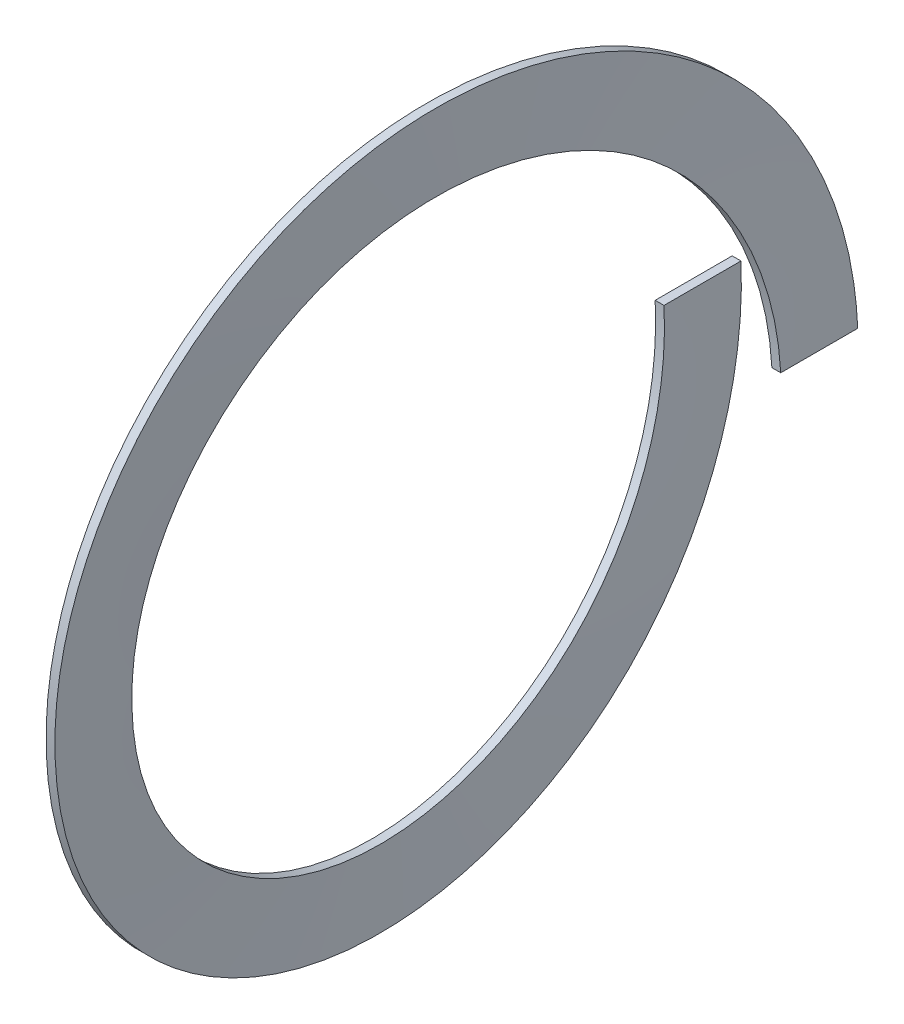
ISO-10303-21;
HEADER;
FILE_DESCRIPTION(('STEP AP214'),'2;1');
FILE_NAME('part.step','',(''),(''),'','','');
FILE_SCHEMA(('AUTOMOTIVE_DESIGN { 1 0 10303 214 1 1 1 1 }'));
ENDSEC;
DATA;
#1=APPLICATION_CONTEXT('core data for automotive mechanical design processes');
#2=APPLICATION_PROTOCOL_DEFINITION('international standard','automotive_design',2000,#1);
#3=PRODUCT_CONTEXT('',#1,'mechanical');
#4=PRODUCT('Part','Part','',(#3));
#5=PRODUCT_RELATED_PRODUCT_CATEGORY('part','',(#4));
#6=PRODUCT_DEFINITION_FORMATION('','',#4);
#7=PRODUCT_DEFINITION_CONTEXT('part definition',#1,'design');
#8=PRODUCT_DEFINITION('design','',#6,#7);
#9=PRODUCT_DEFINITION_SHAPE('','',#8);
#10=(LENGTH_UNIT() NAMED_UNIT(*) SI_UNIT(.MILLI.,.METRE.));
#11=(NAMED_UNIT(*) PLANE_ANGLE_UNIT() SI_UNIT($,.RADIAN.));
#12=(NAMED_UNIT(*) SI_UNIT($,.STERADIAN.) SOLID_ANGLE_UNIT());
#13=UNCERTAINTY_MEASURE_WITH_UNIT(LENGTH_MEASURE(1.E-05),#10,'distance_accuracy_value','');
#14=(GEOMETRIC_REPRESENTATION_CONTEXT(3) GLOBAL_UNCERTAINTY_ASSIGNED_CONTEXT((#13)) GLOBAL_UNIT_ASSIGNED_CONTEXT((#10,
#11,#12)) REPRESENTATION_CONTEXT('',''));
#15=CARTESIAN_POINT('',(0.,0.,0.));
#16=DIRECTION('',(0.,0.,1.));
#17=DIRECTION('',(1.,0.,0.));
#18=AXIS2_PLACEMENT_3D('',#15,#16,#17);
#19=CARTESIAN_POINT('',(0.0264930314053456,0.,-2.));
#20=DIRECTION('',(0.,1.,0.));
#21=DIRECTION('',(0.,0.,1.));
#22=AXIS2_PLACEMENT_3D('',#19,#20,#21);
#23=PLANE('',#22);
#24=DIRECTION('',(0.,0.,-1.));
#25=VECTOR('',#24,1.);
#26=CARTESIAN_POINT('',(0.0264930314053456,0.,-2.));
#27=LINE('',#26,#25);
#28=CARTESIAN_POINT('',(0.0264930314053456,0.,-1.7691519945665));
#29=VERTEX_POINT('',#28);
#30=CARTESIAN_POINT('',(0.0264930314053456,0.,-2.2308480054335));
#31=VERTEX_POINT('',#30);
#32=EDGE_CURVE('E40',#29,#31,#27,.T.);
#33=ORIENTED_EDGE('',*,*,#32,.T.);
#34=DIRECTION('',(-1.,0.,0.));
#35=VECTOR('',#34,1.);
#36=CARTESIAN_POINT('',(0.,0.,-2.2308480054335));
#37=LINE('',#36,#35);
#38=CARTESIAN_POINT('',(-0.0264930314053456,0.,-2.2308480054335));
#39=VERTEX_POINT('',#38);
#40=EDGE_CURVE('E35',#31,#39,#37,.T.);
#41=ORIENTED_EDGE('',*,*,#40,.T.);
#42=DIRECTION('',(0.,0.,1.));
#43=VECTOR('',#42,1.);
#44=CARTESIAN_POINT('',(-0.0264930314053456,0.,-2.));
#45=LINE('',#44,#43);
#46=CARTESIAN_POINT('',(-0.0264930314053456,0.,-1.7691519945665));
#47=VERTEX_POINT('',#46);
#48=EDGE_CURVE('E75',#39,#47,#45,.T.);
#49=ORIENTED_EDGE('',*,*,#48,.T.);
#50=DIRECTION('',(1.,0.,0.));
#51=VECTOR('',#50,1.);
#52=CARTESIAN_POINT('',(0.,0.,-1.7691519945665));
#53=LINE('',#52,#51);
#54=EDGE_CURVE('E56',#47,#29,#53,.T.);
#55=ORIENTED_EDGE('',*,*,#54,.T.);
#56=EDGE_LOOP('',(#33,#41,#49,#55));
#57=FACE_BOUND('',#56,.T.);
#58=ADVANCED_FACE('F31',(#57),#23,.T.);
#59=CARTESIAN_POINT('',(0.726493031405346,0.,-2.));
#60=DIRECTION('',(0.,-1.,0.));
#61=DIRECTION('',(0.,0.,-1.));
#62=AXIS2_PLACEMENT_3D('',#59,#60,#61);
#63=PLANE('',#62);
#64=DIRECTION('',(0.,0.,1.));
#65=VECTOR('',#64,1.);
#66=CARTESIAN_POINT('',(0.726493031405346,0.,-2.));
#67=LINE('',#66,#65);
#68=CARTESIAN_POINT('',(0.726493031405346,0.,-2.2308480054335));
#69=VERTEX_POINT('',#68);
#70=CARTESIAN_POINT('',(0.726493031405346,0.,-1.7691519945665));
#71=VERTEX_POINT('',#70);
#72=EDGE_CURVE('E11',#69,#71,#67,.T.);
#73=ORIENTED_EDGE('',*,*,#72,.T.);
#74=DIRECTION('',(-1.,0.,0.));
#75=VECTOR('',#74,1.);
#76=CARTESIAN_POINT('',(0.7,0.,-1.7691519945665));
#77=LINE('',#76,#75);
#78=CARTESIAN_POINT('',(0.673506968594654,0.,-1.7691519945665));
#79=VERTEX_POINT('',#78);
#80=EDGE_CURVE('E180',#71,#79,#77,.T.);
#81=ORIENTED_EDGE('',*,*,#80,.T.);
#82=DIRECTION('',(0.,0.,-1.));
#83=VECTOR('',#82,1.);
#84=CARTESIAN_POINT('',(0.673506968594654,0.,-2.));
#85=LINE('',#84,#83);
#86=CARTESIAN_POINT('',(0.673506968594654,0.,-2.2308480054335));
#87=VERTEX_POINT('',#86);
#88=EDGE_CURVE('E92',#79,#87,#85,.T.);
#89=ORIENTED_EDGE('',*,*,#88,.T.);
#90=DIRECTION('',(1.,0.,0.));
#91=VECTOR('',#90,1.);
#92=CARTESIAN_POINT('',(0.7,0.,-2.2308480054335));
#93=LINE('',#92,#91);
#94=EDGE_CURVE('E80',#87,#69,#93,.T.);
#95=ORIENTED_EDGE('',*,*,#94,.T.);
#96=EDGE_LOOP('',(#73,#81,#89,#95));
#97=FACE_BOUND('',#96,.T.);
#98=ADVANCED_FACE('F33',(#97),#63,.T.);
#99=CARTESIAN_POINT('',(0.0264930314053456,0.,-1.7691519945665));
#100=CARTESIAN_POINT('',(0.0848263647386789,-1.02142038030033,-1.7691519945665));
#101=CARTESIAN_POINT('',(0.143159698072012,-1.5321305704505,-0.88457599728325));
#102=CARTESIAN_POINT('',(0.201493031405346,-2.04284076060066,0.));
#103=CARTESIAN_POINT('',(0.259826364738679,-1.5321305704505,0.884575997283249));
#104=CARTESIAN_POINT('',(0.318159698072012,-1.02142038030033,1.7691519945665));
#105=CARTESIAN_POINT('',(0.376493031405346,0.,1.7691519945665));
#106=CARTESIAN_POINT('',(0.434826364738679,1.02142038030033,1.7691519945665));
#107=CARTESIAN_POINT('',(0.493159698072012,1.5321305704505,0.88457599728325));
#108=CARTESIAN_POINT('',(0.551493031405346,2.04284076060066,0.));
#109=CARTESIAN_POINT('',(0.609826364738679,1.5321305704505,-0.884575997283248));
#110=CARTESIAN_POINT('',(0.668159698072012,1.02142038030033,-1.7691519945665));
#111=CARTESIAN_POINT('',(0.726493031405346,0.,-1.7691519945665));
#112=CARTESIAN_POINT('',(0.0264930314053456,0.,-2.2308480054335));
#113=CARTESIAN_POINT('',(0.0848263647386789,-1.28798069645817,-2.2308480054335));
#114=CARTESIAN_POINT('',(0.143159698072012,-1.93197104468726,-1.11542400271675));
#115=CARTESIAN_POINT('',(0.201493031405346,-2.57596139291634,0.));
#116=CARTESIAN_POINT('',(0.259826364738679,-1.93197104468726,1.11542400271675));
#117=CARTESIAN_POINT('',(0.318159698072012,-1.28798069645817,2.2308480054335));
#118=CARTESIAN_POINT('',(0.376493031405346,0.,2.2308480054335));
#119=CARTESIAN_POINT('',(0.434826364738679,1.28798069645817,2.2308480054335));
#120=CARTESIAN_POINT('',(0.493159698072012,1.93197104468726,1.11542400271675));
#121=CARTESIAN_POINT('',(0.551493031405346,2.57596139291634,0.));
#122=CARTESIAN_POINT('',(0.609826364738679,1.93197104468726,-1.11542400271675));
#123=CARTESIAN_POINT('',(0.668159698072012,1.28798069645817,-2.2308480054335));
#124=CARTESIAN_POINT('',(0.726493031405346,0.,-2.2308480054335));
#125=(BOUNDED_SURFACE() B_SPLINE_SURFACE(1,2,((#99,#100,#101,#102,#103,#104,#105,#106,#107,#108,
#109,#110,#111),(#112,#113,#114,#115,#116,#117,#118,#119,#120,#121,#122,#123,#124)),
.UNSPECIFIED.,.F.,.F.,.F.) B_SPLINE_SURFACE_WITH_KNOTS((2,2),(3,2,2,2,2,2,3),(0.,1.),(0.,
0.166666666666667,0.333333333333333,0.5,0.666666666666667,0.833333333333333,1.),
.UNSPECIFIED.) GEOMETRIC_REPRESENTATION_ITEM() RATIONAL_B_SPLINE_SURFACE(((1.,0.866025403784439,
1.,0.866025403784439,1.,0.866025403784439,1.,0.866025403784439,1.,0.866025403784439,1.,
0.866025403784439,1.),(1.,0.866025403784439,1.,0.866025403784439,1.,0.866025403784439,1.,
0.866025403784439,1.,0.866025403784439,1.,0.866025403784439,1.))) REPRESENTATION_ITEM('') SURFACE());
#126=CARTESIAN_POINT('',(0.0264930314053456,0.,-1.7691519945665));
#127=CARTESIAN_POINT('',(0.0848263647386789,-1.02142038030033,-1.7691519945665));
#128=CARTESIAN_POINT('',(0.143159698072012,-1.5321305704505,-0.88457599728325));
#129=CARTESIAN_POINT('',(0.201493031405346,-2.04284076060066,0.));
#130=CARTESIAN_POINT('',(0.259826364738679,-1.5321305704505,0.884575997283249));
#131=CARTESIAN_POINT('',(0.318159698072012,-1.02142038030033,1.7691519945665));
#132=CARTESIAN_POINT('',(0.376493031405346,0.,1.7691519945665));
#133=CARTESIAN_POINT('',(0.434826364738679,1.02142038030033,1.7691519945665));
#134=CARTESIAN_POINT('',(0.493159698072012,1.5321305704505,0.88457599728325));
#135=CARTESIAN_POINT('',(0.551493031405346,2.04284076060066,0.));
#136=CARTESIAN_POINT('',(0.609826364738679,1.5321305704505,-0.884575997283248));
#137=CARTESIAN_POINT('',(0.668159698072012,1.02142038030033,-1.7691519945665));
#138=CARTESIAN_POINT('',(0.726493031405346,0.,-1.7691519945665));
#139=(BOUNDED_CURVE() B_SPLINE_CURVE(2,(#126,#127,#128,#129,#130,#131,#132,#133,#134,#135,#136,
#137,#138),.UNSPECIFIED.,.F.,.F.) B_SPLINE_CURVE_WITH_KNOTS((3,2,2,2,2,2,3),(0.,
0.166666666666667,0.333333333333333,0.5,0.666666666666667,0.833333333333333,1.),
.UNSPECIFIED.) CURVE() GEOMETRIC_REPRESENTATION_ITEM() RATIONAL_B_SPLINE_CURVE((1.,
0.866025403784439,1.,0.866025403784439,1.,0.866025403784439,1.,0.866025403784439,1.,
0.866025403784439,1.,0.866025403784439,1.)) REPRESENTATION_ITEM(''));
#140=EDGE_CURVE('E48',#29,#71,#139,.T.);
#141=CARTESIAN_POINT('',(0.0264930314053456,0.,-2.2308480054335));
#142=CARTESIAN_POINT('',(0.0848263647386789,-1.28798069645817,-2.2308480054335));
#143=CARTESIAN_POINT('',(0.143159698072012,-1.93197104468726,-1.11542400271675));
#144=CARTESIAN_POINT('',(0.201493031405346,-2.57596139291634,0.));
#145=CARTESIAN_POINT('',(0.259826364738679,-1.93197104468726,1.11542400271675));
#146=CARTESIAN_POINT('',(0.318159698072012,-1.28798069645817,2.2308480054335));
#147=CARTESIAN_POINT('',(0.376493031405346,0.,2.2308480054335));
#148=CARTESIAN_POINT('',(0.434826364738679,1.28798069645817,2.2308480054335));
#149=CARTESIAN_POINT('',(0.493159698072012,1.93197104468726,1.11542400271675));
#150=CARTESIAN_POINT('',(0.551493031405346,2.57596139291634,0.));
#151=CARTESIAN_POINT('',(0.609826364738679,1.93197104468726,-1.11542400271675));
#152=CARTESIAN_POINT('',(0.668159698072012,1.28798069645817,-2.2308480054335));
#153=CARTESIAN_POINT('',(0.726493031405346,0.,-2.2308480054335));
#154=(BOUNDED_CURVE() B_SPLINE_CURVE(2,(#141,#142,#143,#144,#145,#146,#147,#148,#149,#150,#151,
#152,#153),.UNSPECIFIED.,.F.,.F.) B_SPLINE_CURVE_WITH_KNOTS((3,2,2,2,2,2,3),(0.,
0.166666666666667,0.333333333333333,0.5,0.666666666666667,0.833333333333333,1.),
.UNSPECIFIED.) CURVE() GEOMETRIC_REPRESENTATION_ITEM() RATIONAL_B_SPLINE_CURVE((1.,
0.866025403784439,1.,0.866025403784439,1.,0.866025403784439,1.,0.866025403784439,1.,
0.866025403784439,1.,0.866025403784439,1.)) REPRESENTATION_ITEM(''));
#155=EDGE_CURVE('E87',#31,#69,#154,.T.);
#156=ORIENTED_EDGE('',*,*,#32,.F.);
#157=ORIENTED_EDGE('',*,*,#140,.T.);
#158=ORIENTED_EDGE('',*,*,#72,.F.);
#159=ORIENTED_EDGE('',*,*,#155,.F.);
#160=EDGE_LOOP('',(#156,#157,#158,#159));
#161=FACE_BOUND('',#160,.T.);
#162=ADVANCED_FACE('F99',(#161),#125,.F.);
#163=CARTESIAN_POINT('',(-0.0264930314053456,0.,-1.7691519945665));
#164=CARTESIAN_POINT('',(0.0318403019279877,-1.02142038030033,-1.7691519945665));
#165=CARTESIAN_POINT('',(0.0901736352613211,-1.5321305704505,-0.88457599728325));
#166=CARTESIAN_POINT('',(0.148506968594654,-2.04284076060066,0.));
#167=CARTESIAN_POINT('',(0.206840301927988,-1.5321305704505,0.884575997283249));
#168=CARTESIAN_POINT('',(0.265173635261321,-1.02142038030033,1.7691519945665));
#169=CARTESIAN_POINT('',(0.323506968594654,0.,1.7691519945665));
#170=CARTESIAN_POINT('',(0.381840301927988,1.02142038030033,1.7691519945665));
#171=CARTESIAN_POINT('',(0.440173635261321,1.5321305704505,0.88457599728325));
#172=CARTESIAN_POINT('',(0.498506968594654,2.04284076060066,0.));
#173=CARTESIAN_POINT('',(0.556840301927988,1.5321305704505,-0.884575997283248));
#174=CARTESIAN_POINT('',(0.615173635261321,1.02142038030033,-1.7691519945665));
#175=CARTESIAN_POINT('',(0.673506968594654,0.,-1.7691519945665));
#176=CARTESIAN_POINT('',(0.0264930314053456,0.,-1.7691519945665));
#177=CARTESIAN_POINT('',(0.0848263647386789,-1.02142038030033,-1.7691519945665));
#178=CARTESIAN_POINT('',(0.143159698072012,-1.5321305704505,-0.88457599728325));
#179=CARTESIAN_POINT('',(0.201493031405346,-2.04284076060066,0.));
#180=CARTESIAN_POINT('',(0.259826364738679,-1.5321305704505,0.884575997283249));
#181=CARTESIAN_POINT('',(0.318159698072012,-1.02142038030033,1.7691519945665));
#182=CARTESIAN_POINT('',(0.376493031405346,0.,1.7691519945665));
#183=CARTESIAN_POINT('',(0.434826364738679,1.02142038030033,1.7691519945665));
#184=CARTESIAN_POINT('',(0.493159698072012,1.5321305704505,0.88457599728325));
#185=CARTESIAN_POINT('',(0.551493031405346,2.04284076060066,0.));
#186=CARTESIAN_POINT('',(0.609826364738679,1.5321305704505,-0.884575997283248));
#187=CARTESIAN_POINT('',(0.668159698072012,1.02142038030033,-1.7691519945665));
#188=CARTESIAN_POINT('',(0.726493031405346,0.,-1.7691519945665));
#189=(BOUNDED_SURFACE() B_SPLINE_SURFACE(1,2,((#163,#164,#165,#166,#167,#168,#169,#170,#171,
#172,#173,#174,#175),(#176,#177,#178,#179,#180,#181,#182,#183,#184,#185,#186,#187,#188)),
.UNSPECIFIED.,.F.,.F.,.F.) B_SPLINE_SURFACE_WITH_KNOTS((2,2),(3,2,2,2,2,2,3),(0.,1.),(0.,
0.166666666666667,0.333333333333333,0.5,0.666666666666667,0.833333333333333,1.),
.UNSPECIFIED.) GEOMETRIC_REPRESENTATION_ITEM() RATIONAL_B_SPLINE_SURFACE(((1.,0.866025403784439,
1.,0.866025403784439,1.,0.866025403784439,1.,0.866025403784439,1.,0.866025403784439,1.,
0.866025403784439,1.),(1.,0.866025403784439,1.,0.866025403784439,1.,0.866025403784439,1.,
0.866025403784439,1.,0.866025403784439,1.,0.866025403784439,1.))) REPRESENTATION_ITEM('') SURFACE());
#190=CARTESIAN_POINT('',(-0.0264930314053456,0.,-1.7691519945665));
#191=CARTESIAN_POINT('',(0.0318403019279877,-1.02142038030033,-1.7691519945665));
#192=CARTESIAN_POINT('',(0.0901736352613211,-1.5321305704505,-0.88457599728325));
#193=CARTESIAN_POINT('',(0.148506968594654,-2.04284076060066,0.));
#194=CARTESIAN_POINT('',(0.206840301927988,-1.5321305704505,0.884575997283249));
#195=CARTESIAN_POINT('',(0.265173635261321,-1.02142038030033,1.7691519945665));
#196=CARTESIAN_POINT('',(0.323506968594654,0.,1.7691519945665));
#197=CARTESIAN_POINT('',(0.381840301927988,1.02142038030033,1.7691519945665));
#198=CARTESIAN_POINT('',(0.440173635261321,1.5321305704505,0.88457599728325));
#199=CARTESIAN_POINT('',(0.498506968594654,2.04284076060066,0.));
#200=CARTESIAN_POINT('',(0.556840301927988,1.5321305704505,-0.884575997283248));
#201=CARTESIAN_POINT('',(0.615173635261321,1.02142038030033,-1.7691519945665));
#202=CARTESIAN_POINT('',(0.673506968594654,0.,-1.7691519945665));
#203=(BOUNDED_CURVE() B_SPLINE_CURVE(2,(#190,#191,#192,#193,#194,#195,#196,#197,#198,#199,#200,
#201,#202),.UNSPECIFIED.,.F.,.F.) B_SPLINE_CURVE_WITH_KNOTS((3,2,2,2,2,2,3),(0.,
0.166666666666667,0.333333333333333,0.5,0.666666666666667,0.833333333333333,1.),
.UNSPECIFIED.) CURVE() GEOMETRIC_REPRESENTATION_ITEM() RATIONAL_B_SPLINE_CURVE((1.,
0.866025403784439,1.,0.866025403784439,1.,0.866025403784439,1.,0.866025403784439,1.,
0.866025403784439,1.,0.866025403784439,1.)) REPRESENTATION_ITEM(''));
#204=EDGE_CURVE('E90',#47,#79,#203,.T.);
#205=ORIENTED_EDGE('',*,*,#54,.F.);
#206=ORIENTED_EDGE('',*,*,#204,.T.);
#207=ORIENTED_EDGE('',*,*,#80,.F.);
#208=ORIENTED_EDGE('',*,*,#140,.F.);
#209=EDGE_LOOP('',(#205,#206,#207,#208));
#210=FACE_BOUND('',#209,.T.);
#211=ADVANCED_FACE('F101',(#210),#189,.F.);
#212=CARTESIAN_POINT('',(-0.0264930314053456,0.,-2.2308480054335));
#213=CARTESIAN_POINT('',(0.0318403019279877,-1.28798069645817,-2.2308480054335));
#214=CARTESIAN_POINT('',(0.0901736352613211,-1.93197104468726,-1.11542400271675));
#215=CARTESIAN_POINT('',(0.148506968594654,-2.57596139291634,0.));
#216=CARTESIAN_POINT('',(0.206840301927988,-1.93197104468726,1.11542400271675));
#217=CARTESIAN_POINT('',(0.265173635261321,-1.28798069645817,2.2308480054335));
#218=CARTESIAN_POINT('',(0.323506968594654,0.,2.2308480054335));
#219=CARTESIAN_POINT('',(0.381840301927988,1.28798069645817,2.2308480054335));
#220=CARTESIAN_POINT('',(0.440173635261321,1.93197104468726,1.11542400271675));
#221=CARTESIAN_POINT('',(0.498506968594654,2.57596139291634,0.));
#222=CARTESIAN_POINT('',(0.556840301927988,1.93197104468726,-1.11542400271675));
#223=CARTESIAN_POINT('',(0.615173635261321,1.28798069645817,-2.2308480054335));
#224=CARTESIAN_POINT('',(0.673506968594654,0.,-2.2308480054335));
#225=CARTESIAN_POINT('',(-0.0264930314053456,0.,-1.7691519945665));
#226=CARTESIAN_POINT('',(0.0318403019279877,-1.02142038030033,-1.7691519945665));
#227=CARTESIAN_POINT('',(0.0901736352613211,-1.5321305704505,-0.88457599728325));
#228=CARTESIAN_POINT('',(0.148506968594654,-2.04284076060066,0.));
#229=CARTESIAN_POINT('',(0.206840301927988,-1.5321305704505,0.884575997283249));
#230=CARTESIAN_POINT('',(0.265173635261321,-1.02142038030033,1.7691519945665));
#231=CARTESIAN_POINT('',(0.323506968594654,0.,1.7691519945665));
#232=CARTESIAN_POINT('',(0.381840301927988,1.02142038030033,1.7691519945665));
#233=CARTESIAN_POINT('',(0.440173635261321,1.5321305704505,0.88457599728325));
#234=CARTESIAN_POINT('',(0.498506968594654,2.04284076060066,0.));
#235=CARTESIAN_POINT('',(0.556840301927988,1.5321305704505,-0.884575997283248));
#236=CARTESIAN_POINT('',(0.615173635261321,1.02142038030033,-1.7691519945665));
#237=CARTESIAN_POINT('',(0.673506968594654,0.,-1.7691519945665));
#238=(BOUNDED_SURFACE() B_SPLINE_SURFACE(1,2,((#212,#213,#214,#215,#216,#217,#218,#219,#220,
#221,#222,#223,#224),(#225,#226,#227,#228,#229,#230,#231,#232,#233,#234,#235,#236,#237)),
.UNSPECIFIED.,.F.,.F.,.F.) B_SPLINE_SURFACE_WITH_KNOTS((2,2),(3,2,2,2,2,2,3),(0.,1.),(0.,
0.166666666666667,0.333333333333333,0.5,0.666666666666667,0.833333333333333,1.),
.UNSPECIFIED.) GEOMETRIC_REPRESENTATION_ITEM() RATIONAL_B_SPLINE_SURFACE(((1.,0.866025403784439,
1.,0.866025403784439,1.,0.866025403784439,1.,0.866025403784439,1.,0.866025403784439,1.,
0.866025403784439,1.),(1.,0.866025403784439,1.,0.866025403784439,1.,0.866025403784439,1.,
0.866025403784439,1.,0.866025403784439,1.,0.866025403784439,1.))) REPRESENTATION_ITEM('') SURFACE());
#239=CARTESIAN_POINT('',(-0.0264930314053456,0.,-2.2308480054335));
#240=CARTESIAN_POINT('',(0.0318403019279877,-1.28798069645817,-2.2308480054335));
#241=CARTESIAN_POINT('',(0.0901736352613211,-1.93197104468726,-1.11542400271675));
#242=CARTESIAN_POINT('',(0.148506968594654,-2.57596139291634,0.));
#243=CARTESIAN_POINT('',(0.206840301927988,-1.93197104468726,1.11542400271675));
#244=CARTESIAN_POINT('',(0.265173635261321,-1.28798069645817,2.2308480054335));
#245=CARTESIAN_POINT('',(0.323506968594654,0.,2.2308480054335));
#246=CARTESIAN_POINT('',(0.381840301927988,1.28798069645817,2.2308480054335));
#247=CARTESIAN_POINT('',(0.440173635261321,1.93197104468726,1.11542400271675));
#248=CARTESIAN_POINT('',(0.498506968594654,2.57596139291634,0.));
#249=CARTESIAN_POINT('',(0.556840301927988,1.93197104468726,-1.11542400271675));
#250=CARTESIAN_POINT('',(0.615173635261321,1.28798069645817,-2.2308480054335));
#251=CARTESIAN_POINT('',(0.673506968594654,0.,-2.2308480054335));
#252=(BOUNDED_CURVE() B_SPLINE_CURVE(2,(#239,#240,#241,#242,#243,#244,#245,#246,#247,#248,#249,
#250,#251),.UNSPECIFIED.,.F.,.F.) B_SPLINE_CURVE_WITH_KNOTS((3,2,2,2,2,2,3),(0.,
0.166666666666667,0.333333333333333,0.5,0.666666666666667,0.833333333333333,1.),
.UNSPECIFIED.) CURVE() GEOMETRIC_REPRESENTATION_ITEM() RATIONAL_B_SPLINE_CURVE((1.,
0.866025403784439,1.,0.866025403784439,1.,0.866025403784439,1.,0.866025403784439,1.,
0.866025403784439,1.,0.866025403784439,1.)) REPRESENTATION_ITEM(''));
#253=EDGE_CURVE('E82',#39,#87,#252,.T.);
#254=ORIENTED_EDGE('',*,*,#48,.F.);
#255=ORIENTED_EDGE('',*,*,#253,.T.);
#256=ORIENTED_EDGE('',*,*,#88,.F.);
#257=ORIENTED_EDGE('',*,*,#204,.F.);
#258=EDGE_LOOP('',(#254,#255,#256,#257));
#259=FACE_BOUND('',#258,.T.);
#260=ADVANCED_FACE('F89',(#259),#238,.F.);
#261=CARTESIAN_POINT('',(0.0264930314053456,0.,-2.2308480054335));
#262=CARTESIAN_POINT('',(0.0848263647386789,-1.28798069645817,-2.2308480054335));
#263=CARTESIAN_POINT('',(0.143159698072012,-1.93197104468726,-1.11542400271675));
#264=CARTESIAN_POINT('',(0.201493031405346,-2.57596139291634,0.));
#265=CARTESIAN_POINT('',(0.259826364738679,-1.93197104468726,1.11542400271675));
#266=CARTESIAN_POINT('',(0.318159698072012,-1.28798069645817,2.2308480054335));
#267=CARTESIAN_POINT('',(0.376493031405346,0.,2.2308480054335));
#268=CARTESIAN_POINT('',(0.434826364738679,1.28798069645817,2.2308480054335));
#269=CARTESIAN_POINT('',(0.493159698072012,1.93197104468726,1.11542400271675));
#270=CARTESIAN_POINT('',(0.551493031405346,2.57596139291634,0.));
#271=CARTESIAN_POINT('',(0.609826364738679,1.93197104468726,-1.11542400271675));
#272=CARTESIAN_POINT('',(0.668159698072012,1.28798069645817,-2.2308480054335));
#273=CARTESIAN_POINT('',(0.726493031405346,0.,-2.2308480054335));
#274=CARTESIAN_POINT('',(-0.0264930314053456,0.,-2.2308480054335));
#275=CARTESIAN_POINT('',(0.0318403019279877,-1.28798069645817,-2.2308480054335));
#276=CARTESIAN_POINT('',(0.0901736352613211,-1.93197104468726,-1.11542400271675));
#277=CARTESIAN_POINT('',(0.148506968594654,-2.57596139291634,0.));
#278=CARTESIAN_POINT('',(0.206840301927988,-1.93197104468726,1.11542400271675));
#279=CARTESIAN_POINT('',(0.265173635261321,-1.28798069645817,2.2308480054335));
#280=CARTESIAN_POINT('',(0.323506968594654,0.,2.2308480054335));
#281=CARTESIAN_POINT('',(0.381840301927988,1.28798069645817,2.2308480054335));
#282=CARTESIAN_POINT('',(0.440173635261321,1.93197104468726,1.11542400271675));
#283=CARTESIAN_POINT('',(0.498506968594654,2.57596139291634,0.));
#284=CARTESIAN_POINT('',(0.556840301927988,1.93197104468726,-1.11542400271675));
#285=CARTESIAN_POINT('',(0.615173635261321,1.28798069645817,-2.2308480054335));
#286=CARTESIAN_POINT('',(0.673506968594654,0.,-2.2308480054335));
#287=(BOUNDED_SURFACE() B_SPLINE_SURFACE(1,2,((#261,#262,#263,#264,#265,#266,#267,#268,#269,
#270,#271,#272,#273),(#274,#275,#276,#277,#278,#279,#280,#281,#282,#283,#284,#285,#286)),
.UNSPECIFIED.,.F.,.F.,.F.) B_SPLINE_SURFACE_WITH_KNOTS((2,2),(3,2,2,2,2,2,3),(0.,1.),(0.,
0.166666666666667,0.333333333333333,0.5,0.666666666666667,0.833333333333333,1.),
.UNSPECIFIED.) GEOMETRIC_REPRESENTATION_ITEM() RATIONAL_B_SPLINE_SURFACE(((1.,0.866025403784439,
1.,0.866025403784439,1.,0.866025403784439,1.,0.866025403784439,1.,0.866025403784439,1.,
0.866025403784439,1.),(1.,0.866025403784439,1.,0.866025403784439,1.,0.866025403784439,1.,
0.866025403784439,1.,0.866025403784439,1.,0.866025403784439,1.))) REPRESENTATION_ITEM('') SURFACE());
#288=ORIENTED_EDGE('',*,*,#40,.F.);
#289=ORIENTED_EDGE('',*,*,#155,.T.);
#290=ORIENTED_EDGE('',*,*,#94,.F.);
#291=ORIENTED_EDGE('',*,*,#253,.F.);
#292=EDGE_LOOP('',(#288,#289,#290,#291));
#293=FACE_BOUND('',#292,.T.);
#294=ADVANCED_FACE('F83',(#293),#287,.F.);
#295=CLOSED_SHELL('',(#58,#98,#162,#211,#260,#294));
#296=MANIFOLD_SOLID_BREP('B2',#295);
#297=ADVANCED_BREP_SHAPE_REPRESENTATION('',(#18,#296),#14);
#298=SHAPE_DEFINITION_REPRESENTATION(#9,#297);
ENDSEC;
END-ISO-10303-21;
